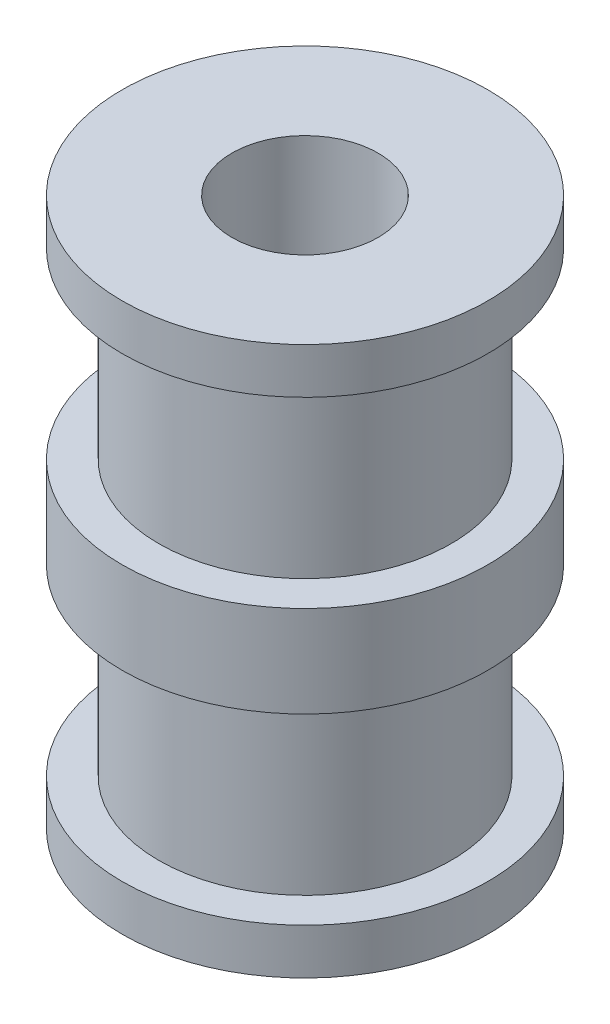
ISO-10303-21;
HEADER;
FILE_DESCRIPTION(('STEP AP214'),'2;1');
FILE_NAME('part.step','',(''),(''),'','','');
FILE_SCHEMA(('AUTOMOTIVE_DESIGN { 1 0 10303 214 1 1 1 1 }'));
ENDSEC;
DATA;
#1=APPLICATION_CONTEXT('core data for automotive mechanical design processes');
#2=APPLICATION_PROTOCOL_DEFINITION('international standard','automotive_design',2000,#1);
#3=PRODUCT_CONTEXT('',#1,'mechanical');
#4=PRODUCT('Part','Part','',(#3));
#5=PRODUCT_RELATED_PRODUCT_CATEGORY('part','',(#4));
#6=PRODUCT_DEFINITION_FORMATION('','',#4);
#7=PRODUCT_DEFINITION_CONTEXT('part definition',#1,'design');
#8=PRODUCT_DEFINITION('design','',#6,#7);
#9=PRODUCT_DEFINITION_SHAPE('','',#8);
#10=(LENGTH_UNIT() NAMED_UNIT(*) SI_UNIT(.MILLI.,.METRE.));
#11=(NAMED_UNIT(*) PLANE_ANGLE_UNIT() SI_UNIT($,.RADIAN.));
#12=(NAMED_UNIT(*) SI_UNIT($,.STERADIAN.) SOLID_ANGLE_UNIT());
#13=UNCERTAINTY_MEASURE_WITH_UNIT(LENGTH_MEASURE(1.E-05),#10,'distance_accuracy_value','');
#14=(GEOMETRIC_REPRESENTATION_CONTEXT(3) GLOBAL_UNCERTAINTY_ASSIGNED_CONTEXT((#13)) GLOBAL_UNIT_ASSIGNED_CONTEXT((#10,
#11,#12)) REPRESENTATION_CONTEXT('',''));
#15=CARTESIAN_POINT('',(0.,0.,0.));
#16=DIRECTION('',(0.,0.,1.));
#17=DIRECTION('',(1.,0.,0.));
#18=AXIS2_PLACEMENT_3D('',#15,#16,#17);
#19=CARTESIAN_POINT('',(0.,15.,0.));
#20=DIRECTION('',(0.,-1.,0.));
#21=DIRECTION('',(0.,0.,-1.));
#22=AXIS2_PLACEMENT_3D('',#19,#20,#21);
#23=CYLINDRICAL_SURFACE('',#22,4.);
#24=CARTESIAN_POINT('',(0.,8.75,0.));
#25=DIRECTION('',(0.,1.,0.));
#26=DIRECTION('',(0.,0.,1.));
#27=AXIS2_PLACEMENT_3D('',#24,#25,#26);
#28=CIRCLE('',#27,4.);
#29=CARTESIAN_POINT('',(0.,8.75,4.));
#30=VERTEX_POINT('',#29);
#31=EDGE_CURVE('E56',#30,#30,#28,.T.);
#32=ORIENTED_EDGE('',*,*,#31,.T.);
#33=EDGE_LOOP('',(#32));
#34=FACE_BOUND('',#33,.T.);
#35=CARTESIAN_POINT('',(0.,13.75,0.));
#36=DIRECTION('',(0.,1.,0.));
#37=DIRECTION('',(0.,0.,1.));
#38=AXIS2_PLACEMENT_3D('',#35,#36,#37);
#39=CIRCLE('',#38,4.);
#40=CARTESIAN_POINT('',(0.,13.75,4.));
#41=VERTEX_POINT('',#40);
#42=EDGE_CURVE('E10',#41,#41,#39,.T.);
#43=ORIENTED_EDGE('',*,*,#42,.F.);
#44=EDGE_LOOP('',(#43));
#45=FACE_BOUND('',#44,.T.);
#46=ADVANCED_FACE('F35',(#34,#45),#23,.T.);
#47=CARTESIAN_POINT('',(0.,1.25,0.));
#48=DIRECTION('',(0.,1.,0.));
#49=DIRECTION('',(0.,0.,1.));
#50=AXIS2_PLACEMENT_3D('',#47,#48,#49);
#51=CIRCLE('',#50,4.);
#52=CARTESIAN_POINT('',(0.,1.25,4.));
#53=VERTEX_POINT('',#52);
#54=EDGE_CURVE('E67',#53,#53,#51,.T.);
#55=ORIENTED_EDGE('',*,*,#54,.T.);
#56=EDGE_LOOP('',(#55));
#57=FACE_BOUND('',#56,.T.);
#58=CARTESIAN_POINT('',(0.,6.25,0.));
#59=DIRECTION('',(0.,1.,0.));
#60=DIRECTION('',(0.,0.,1.));
#61=AXIS2_PLACEMENT_3D('',#58,#59,#60);
#62=CIRCLE('',#61,4.);
#63=CARTESIAN_POINT('',(0.,6.25,4.));
#64=VERTEX_POINT('',#63);
#65=EDGE_CURVE('E42',#64,#64,#62,.T.);
#66=ORIENTED_EDGE('',*,*,#65,.F.);
#67=EDGE_LOOP('',(#66));
#68=FACE_BOUND('',#67,.T.);
#69=ADVANCED_FACE('F95',(#57,#68),#23,.T.);
#70=CARTESIAN_POINT('',(0.,15.,0.));
#71=DIRECTION('',(0.,1.,0.));
#72=DIRECTION('',(0.,0.,1.));
#73=AXIS2_PLACEMENT_3D('',#70,#71,#72);
#74=PLANE('',#73);
#75=CARTESIAN_POINT('',(0.,15.,0.));
#76=DIRECTION('',(0.,1.,0.));
#77=DIRECTION('',(0.,0.,1.));
#78=AXIS2_PLACEMENT_3D('',#75,#76,#77);
#79=CIRCLE('',#78,2.);
#80=CARTESIAN_POINT('',(0.,15.,2.));
#81=VERTEX_POINT('',#80);
#82=EDGE_CURVE('E47',#81,#81,#79,.T.);
#83=ORIENTED_EDGE('',*,*,#82,.F.);
#84=EDGE_LOOP('',(#83));
#85=FACE_BOUND('',#84,.T.);
#86=CARTESIAN_POINT('',(0.,15.,0.));
#87=DIRECTION('',(0.,1.,0.));
#88=DIRECTION('',(0.,0.,1.));
#89=AXIS2_PLACEMENT_3D('',#86,#87,#88);
#90=CIRCLE('',#89,5.);
#91=CARTESIAN_POINT('',(0.,15.,5.));
#92=VERTEX_POINT('',#91);
#93=EDGE_CURVE('E51',#92,#92,#90,.T.);
#94=ORIENTED_EDGE('',*,*,#93,.T.);
#95=EDGE_LOOP('',(#94));
#96=FACE_BOUND('',#95,.T.);
#97=ADVANCED_FACE('F91',(#85,#96),#74,.T.);
#98=CARTESIAN_POINT('',(0.,0.,0.));
#99=DIRECTION('',(0.,1.,0.));
#100=DIRECTION('',(0.,0.,1.));
#101=AXIS2_PLACEMENT_3D('',#98,#99,#100);
#102=PLANE('',#101);
#103=CARTESIAN_POINT('',(0.,0.,0.));
#104=DIRECTION('',(0.,1.,0.));
#105=DIRECTION('',(0.,0.,1.));
#106=AXIS2_PLACEMENT_3D('',#103,#104,#105);
#107=CIRCLE('',#106,2.);
#108=CARTESIAN_POINT('',(0.,0.,2.));
#109=VERTEX_POINT('',#108);
#110=EDGE_CURVE('E38',#109,#109,#107,.T.);
#111=ORIENTED_EDGE('',*,*,#110,.T.);
#112=EDGE_LOOP('',(#111));
#113=FACE_BOUND('',#112,.T.);
#114=CARTESIAN_POINT('',(0.,0.,0.));
#115=DIRECTION('',(0.,1.,0.));
#116=DIRECTION('',(0.,0.,1.));
#117=AXIS2_PLACEMENT_3D('',#114,#115,#116);
#118=CIRCLE('',#117,5.);
#119=CARTESIAN_POINT('',(0.,0.,5.));
#120=VERTEX_POINT('',#119);
#121=EDGE_CURVE('E63',#120,#120,#118,.T.);
#122=ORIENTED_EDGE('',*,*,#121,.F.);
#123=EDGE_LOOP('',(#122));
#124=FACE_BOUND('',#123,.T.);
#125=ADVANCED_FACE('F77',(#113,#124),#102,.F.);
#126=CARTESIAN_POINT('',(0.,15.,0.));
#127=DIRECTION('',(0.,-1.,0.));
#128=DIRECTION('',(0.,0.,-1.));
#129=AXIS2_PLACEMENT_3D('',#126,#127,#128);
#130=CYLINDRICAL_SURFACE('',#129,2.);
#131=ORIENTED_EDGE('',*,*,#82,.T.);
#132=EDGE_LOOP('',(#131));
#133=FACE_BOUND('',#132,.T.);
#134=ORIENTED_EDGE('',*,*,#110,.F.);
#135=EDGE_LOOP('',(#134));
#136=FACE_BOUND('',#135,.T.);
#137=ADVANCED_FACE('F80',(#133,#136),#130,.F.);
#138=CARTESIAN_POINT('',(0.,1.25,0.));
#139=DIRECTION('',(0.,1.,0.));
#140=DIRECTION('',(0.,0.,1.));
#141=AXIS2_PLACEMENT_3D('',#138,#139,#140);
#142=PLANE('',#141);
#143=CARTESIAN_POINT('',(0.,1.25,0.));
#144=DIRECTION('',(0.,1.,0.));
#145=DIRECTION('',(0.,0.,1.));
#146=AXIS2_PLACEMENT_3D('',#143,#144,#145);
#147=CIRCLE('',#146,5.);
#148=CARTESIAN_POINT('',(0.,1.25,5.));
#149=VERTEX_POINT('',#148);
#150=EDGE_CURVE('E64',#149,#149,#147,.T.);
#151=ORIENTED_EDGE('',*,*,#150,.T.);
#152=EDGE_LOOP('',(#151));
#153=FACE_BOUND('',#152,.T.);
#154=ORIENTED_EDGE('',*,*,#54,.F.);
#155=EDGE_LOOP('',(#154));
#156=FACE_BOUND('',#155,.T.);
#157=ADVANCED_FACE('F82',(#153,#156),#142,.T.);
#158=CARTESIAN_POINT('',(0.,1.25,0.));
#159=DIRECTION('',(0.,-1.,0.));
#160=DIRECTION('',(0.,0.,-1.));
#161=AXIS2_PLACEMENT_3D('',#158,#159,#160);
#162=CYLINDRICAL_SURFACE('',#161,5.);
#163=ORIENTED_EDGE('',*,*,#150,.F.);
#164=EDGE_LOOP('',(#163));
#165=FACE_BOUND('',#164,.T.);
#166=ORIENTED_EDGE('',*,*,#121,.T.);
#167=EDGE_LOOP('',(#166));
#168=FACE_BOUND('',#167,.T.);
#169=ADVANCED_FACE('F88',(#165,#168),#162,.T.);
#170=CARTESIAN_POINT('',(0.,8.75,0.));
#171=DIRECTION('',(0.,1.,0.));
#172=DIRECTION('',(0.,0.,1.));
#173=AXIS2_PLACEMENT_3D('',#170,#171,#172);
#174=PLANE('',#173);
#175=CARTESIAN_POINT('',(0.,8.75,0.));
#176=DIRECTION('',(0.,1.,0.));
#177=DIRECTION('',(0.,0.,1.));
#178=AXIS2_PLACEMENT_3D('',#175,#176,#177);
#179=CIRCLE('',#178,5.);
#180=CARTESIAN_POINT('',(0.,8.75,5.));
#181=VERTEX_POINT('',#180);
#182=EDGE_CURVE('E53',#181,#181,#179,.T.);
#183=ORIENTED_EDGE('',*,*,#182,.T.);
#184=EDGE_LOOP('',(#183));
#185=FACE_BOUND('',#184,.T.);
#186=ORIENTED_EDGE('',*,*,#31,.F.);
#187=EDGE_LOOP('',(#186));
#188=FACE_BOUND('',#187,.T.);
#189=ADVANCED_FACE('F104',(#185,#188),#174,.T.);
#190=CARTESIAN_POINT('',(0.,6.25,0.));
#191=DIRECTION('',(0.,1.,0.));
#192=DIRECTION('',(0.,0.,1.));
#193=AXIS2_PLACEMENT_3D('',#190,#191,#192);
#194=PLANE('',#193);
#195=CARTESIAN_POINT('',(0.,6.25,0.));
#196=DIRECTION('',(0.,1.,0.));
#197=DIRECTION('',(0.,0.,1.));
#198=AXIS2_PLACEMENT_3D('',#195,#196,#197);
#199=CIRCLE('',#198,5.);
#200=CARTESIAN_POINT('',(0.,6.25,5.));
#201=VERTEX_POINT('',#200);
#202=EDGE_CURVE('E57',#201,#201,#199,.T.);
#203=ORIENTED_EDGE('',*,*,#202,.F.);
#204=EDGE_LOOP('',(#203));
#205=FACE_BOUND('',#204,.T.);
#206=ORIENTED_EDGE('',*,*,#65,.T.);
#207=EDGE_LOOP('',(#206));
#208=FACE_BOUND('',#207,.T.);
#209=ADVANCED_FACE('F106',(#205,#208),#194,.F.);
#210=CARTESIAN_POINT('',(0.,8.75,0.));
#211=DIRECTION('',(0.,-1.,0.));
#212=DIRECTION('',(0.,0.,-1.));
#213=AXIS2_PLACEMENT_3D('',#210,#211,#212);
#214=CYLINDRICAL_SURFACE('',#213,5.);
#215=ORIENTED_EDGE('',*,*,#182,.F.);
#216=EDGE_LOOP('',(#215));
#217=FACE_BOUND('',#216,.T.);
#218=ORIENTED_EDGE('',*,*,#202,.T.);
#219=EDGE_LOOP('',(#218));
#220=FACE_BOUND('',#219,.T.);
#221=ADVANCED_FACE('F113',(#217,#220),#214,.T.);
#222=CARTESIAN_POINT('',(0.,13.75,0.));
#223=DIRECTION('',(0.,1.,0.));
#224=DIRECTION('',(0.,0.,1.));
#225=AXIS2_PLACEMENT_3D('',#222,#223,#224);
#226=PLANE('',#225);
#227=CARTESIAN_POINT('',(0.,13.75,0.));
#228=DIRECTION('',(0.,1.,0.));
#229=DIRECTION('',(0.,0.,1.));
#230=AXIS2_PLACEMENT_3D('',#227,#228,#229);
#231=CIRCLE('',#230,5.);
#232=CARTESIAN_POINT('',(0.,13.75,5.));
#233=VERTEX_POINT('',#232);
#234=EDGE_CURVE('E59',#233,#233,#231,.T.);
#235=ORIENTED_EDGE('',*,*,#234,.F.);
#236=EDGE_LOOP('',(#235));
#237=FACE_BOUND('',#236,.T.);
#238=ORIENTED_EDGE('',*,*,#42,.T.);
#239=EDGE_LOOP('',(#238));
#240=FACE_BOUND('',#239,.T.);
#241=ADVANCED_FACE('F122',(#237,#240),#226,.F.);
#242=CARTESIAN_POINT('',(0.,13.75,0.));
#243=DIRECTION('',(0.,1.,0.));
#244=DIRECTION('',(0.,0.,1.));
#245=AXIS2_PLACEMENT_3D('',#242,#243,#244);
#246=CYLINDRICAL_SURFACE('',#245,5.);
#247=ORIENTED_EDGE('',*,*,#234,.T.);
#248=EDGE_LOOP('',(#247));
#249=FACE_BOUND('',#248,.T.);
#250=ORIENTED_EDGE('',*,*,#93,.F.);
#251=EDGE_LOOP('',(#250));
#252=FACE_BOUND('',#251,.T.);
#253=ADVANCED_FACE('F118',(#249,#252),#246,.T.);
#254=CLOSED_SHELL('',(#46,#69,#97,#125,#137,#157,#169,#189,#209,#221,#241,#253));
#255=MANIFOLD_SOLID_BREP('B2',#254);
#256=ADVANCED_BREP_SHAPE_REPRESENTATION('',(#18,#255),#14);
#257=SHAPE_DEFINITION_REPRESENTATION(#9,#256);
ENDSEC;
END-ISO-10303-21;
